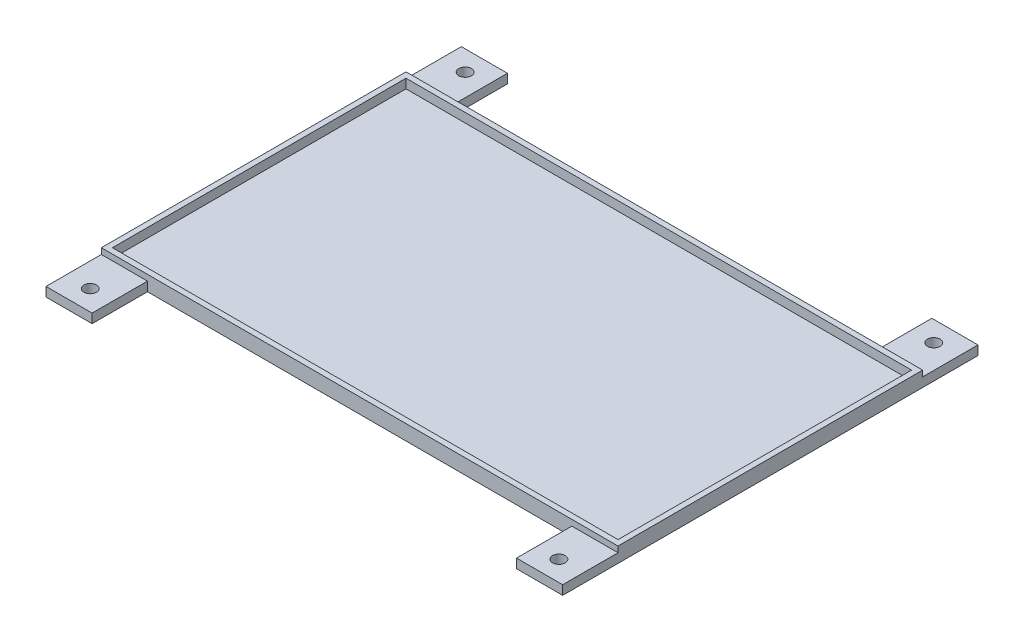
ISO-10303-21;
HEADER;
FILE_DESCRIPTION(('STEP AP214'),'2;1');
FILE_NAME('part.step','',(''),(''),'','','');
FILE_SCHEMA(('AUTOMOTIVE_DESIGN { 1 0 10303 214 1 1 1 1 }'));
ENDSEC;
DATA;
#1=APPLICATION_CONTEXT('core data for automotive mechanical design processes');
#2=APPLICATION_PROTOCOL_DEFINITION('international standard','automotive_design',2000,#1);
#3=PRODUCT_CONTEXT('',#1,'mechanical');
#4=PRODUCT('Part','Part','',(#3));
#5=PRODUCT_RELATED_PRODUCT_CATEGORY('part','',(#4));
#6=PRODUCT_DEFINITION_FORMATION('','',#4);
#7=PRODUCT_DEFINITION_CONTEXT('part definition',#1,'design');
#8=PRODUCT_DEFINITION('design','',#6,#7);
#9=PRODUCT_DEFINITION_SHAPE('','',#8);
#10=(LENGTH_UNIT() NAMED_UNIT(*) SI_UNIT(.MILLI.,.METRE.));
#11=(NAMED_UNIT(*) PLANE_ANGLE_UNIT() SI_UNIT($,.RADIAN.));
#12=(NAMED_UNIT(*) SI_UNIT($,.STERADIAN.) SOLID_ANGLE_UNIT());
#13=UNCERTAINTY_MEASURE_WITH_UNIT(LENGTH_MEASURE(1.E-05),#10,'distance_accuracy_value','');
#14=(GEOMETRIC_REPRESENTATION_CONTEXT(3) GLOBAL_UNCERTAINTY_ASSIGNED_CONTEXT((#13)) GLOBAL_UNIT_ASSIGNED_CONTEXT((#10,
#11,#12)) REPRESENTATION_CONTEXT('',''));
#15=CARTESIAN_POINT('',(0.,0.,0.));
#16=DIRECTION('',(0.,0.,1.));
#17=DIRECTION('',(1.,0.,0.));
#18=AXIS2_PLACEMENT_3D('',#15,#16,#17);
#19=CARTESIAN_POINT('',(-140.,3.175,-82.55));
#20=DIRECTION('',(0.,0.,1.));
#21=DIRECTION('',(1.,0.,0.));
#22=AXIS2_PLACEMENT_3D('',#19,#20,#21);
#23=PLANE('',#22);
#24=DIRECTION('',(1.,0.,0.));
#25=VECTOR('',#24,1.);
#26=CARTESIAN_POINT('',(140.,5.,-82.55));
#27=LINE('',#26,#25);
#28=CARTESIAN_POINT('',(115.,5.,-82.55));
#29=VERTEX_POINT('',#28);
#30=CARTESIAN_POINT('',(140.,5.,-82.55));
#31=VERTEX_POINT('',#30);
#32=EDGE_CURVE('E254',#29,#31,#27,.T.);
#33=ORIENTED_EDGE('',*,*,#32,.F.);
#34=DIRECTION('',(0.,-1.,0.));
#35=VECTOR('',#34,1.);
#36=CARTESIAN_POINT('',(115.,5.,-82.55));
#37=LINE('',#36,#35);
#38=CARTESIAN_POINT('',(115.,0.,-82.55));
#39=VERTEX_POINT('',#38);
#40=EDGE_CURVE('E251',#29,#39,#37,.T.);
#41=ORIENTED_EDGE('',*,*,#40,.T.);
#42=DIRECTION('',(-1.,0.,0.));
#43=VECTOR('',#42,1.);
#44=CARTESIAN_POINT('',(-140.,0.,-82.55));
#45=LINE('',#44,#43);
#46=CARTESIAN_POINT('',(-115.,0.,-82.55));
#47=VERTEX_POINT('',#46);
#48=EDGE_CURVE('E67',#39,#47,#45,.T.);
#49=ORIENTED_EDGE('',*,*,#48,.T.);
#50=DIRECTION('',(0.,-1.,0.));
#51=VECTOR('',#50,1.);
#52=CARTESIAN_POINT('',(-115.,5.,-82.55));
#53=LINE('',#52,#51);
#54=CARTESIAN_POINT('',(-115.,5.,-82.55));
#55=VERTEX_POINT('',#54);
#56=EDGE_CURVE('E352',#55,#47,#53,.T.);
#57=ORIENTED_EDGE('',*,*,#56,.F.);
#58=DIRECTION('',(1.,0.,0.));
#59=VECTOR('',#58,1.);
#60=CARTESIAN_POINT('',(-140.,5.,-82.55));
#61=LINE('',#60,#59);
#62=CARTESIAN_POINT('',(-140.,5.,-82.55));
#63=VERTEX_POINT('',#62);
#64=EDGE_CURVE('E61',#63,#55,#61,.T.);
#65=ORIENTED_EDGE('',*,*,#64,.F.);
#66=DIRECTION('',(0.,-1.,0.));
#67=VECTOR('',#66,1.);
#68=CARTESIAN_POINT('',(-140.,3.175,-82.55));
#69=LINE('',#68,#67);
#70=CARTESIAN_POINT('',(-140.,8.175,-82.55));
#71=VERTEX_POINT('',#70);
#72=EDGE_CURVE('E54',#71,#63,#69,.T.);
#73=ORIENTED_EDGE('',*,*,#72,.F.);
#74=DIRECTION('',(-1.,0.,0.));
#75=VECTOR('',#74,1.);
#76=CARTESIAN_POINT('',(140.,8.175,-82.55));
#77=LINE('',#76,#75);
#78=CARTESIAN_POINT('',(140.,8.175,-82.55));
#79=VERTEX_POINT('',#78);
#80=EDGE_CURVE('E405',#79,#71,#77,.T.);
#81=ORIENTED_EDGE('',*,*,#80,.F.);
#82=DIRECTION('',(0.,-1.,0.));
#83=VECTOR('',#82,1.);
#84=CARTESIAN_POINT('',(140.,3.175,-82.55));
#85=LINE('',#84,#83);
#86=EDGE_CURVE('E11',#79,#31,#85,.T.);
#87=ORIENTED_EDGE('',*,*,#86,.T.);
#88=EDGE_LOOP('',(#33,#41,#49,#57,#65,#73,#81,#87));
#89=FACE_BOUND('',#88,.T.);
#90=ADVANCED_FACE('F45',(#89),#23,.F.);
#91=CARTESIAN_POINT('',(-140.,3.175,82.55));
#92=DIRECTION('',(0.,0.,-1.));
#93=DIRECTION('',(-1.,0.,0.));
#94=AXIS2_PLACEMENT_3D('',#91,#92,#93);
#95=PLANE('',#94);
#96=DIRECTION('',(-1.,0.,0.));
#97=VECTOR('',#96,1.);
#98=CARTESIAN_POINT('',(-140.,5.,82.55));
#99=LINE('',#98,#97);
#100=CARTESIAN_POINT('',(-115.,5.,82.55));
#101=VERTEX_POINT('',#100);
#102=CARTESIAN_POINT('',(-140.,5.,82.55));
#103=VERTEX_POINT('',#102);
#104=EDGE_CURVE('E292',#101,#103,#99,.T.);
#105=ORIENTED_EDGE('',*,*,#104,.F.);
#106=DIRECTION('',(0.,-1.,0.));
#107=VECTOR('',#106,1.);
#108=CARTESIAN_POINT('',(-115.,5.,82.55));
#109=LINE('',#108,#107);
#110=CARTESIAN_POINT('',(-115.,0.,82.55));
#111=VERTEX_POINT('',#110);
#112=EDGE_CURVE('E288',#101,#111,#109,.T.);
#113=ORIENTED_EDGE('',*,*,#112,.T.);
#114=DIRECTION('',(1.,0.,0.));
#115=VECTOR('',#114,1.);
#116=CARTESIAN_POINT('',(-140.,0.,82.55));
#117=LINE('',#116,#115);
#118=CARTESIAN_POINT('',(115.,0.,82.55));
#119=VERTEX_POINT('',#118);
#120=EDGE_CURVE('E417',#111,#119,#117,.T.);
#121=ORIENTED_EDGE('',*,*,#120,.T.);
#122=DIRECTION('',(0.,-1.,0.));
#123=VECTOR('',#122,1.);
#124=CARTESIAN_POINT('',(115.,5.,82.55));
#125=LINE('',#124,#123);
#126=CARTESIAN_POINT('',(115.,5.,82.55));
#127=VERTEX_POINT('',#126);
#128=EDGE_CURVE('E220',#127,#119,#125,.T.);
#129=ORIENTED_EDGE('',*,*,#128,.F.);
#130=DIRECTION('',(-1.,0.,0.));
#131=VECTOR('',#130,1.);
#132=CARTESIAN_POINT('',(140.,5.,82.55));
#133=LINE('',#132,#131);
#134=CARTESIAN_POINT('',(140.,5.,82.55));
#135=VERTEX_POINT('',#134);
#136=EDGE_CURVE('E229',#135,#127,#133,.T.);
#137=ORIENTED_EDGE('',*,*,#136,.F.);
#138=DIRECTION('',(0.,-1.,0.));
#139=VECTOR('',#138,1.);
#140=CARTESIAN_POINT('',(140.,3.175,82.55));
#141=LINE('',#140,#139);
#142=CARTESIAN_POINT('',(140.,8.175,82.55));
#143=VERTEX_POINT('',#142);
#144=EDGE_CURVE('E420',#143,#135,#141,.T.);
#145=ORIENTED_EDGE('',*,*,#144,.F.);
#146=DIRECTION('',(1.,0.,0.));
#147=VECTOR('',#146,1.);
#148=CARTESIAN_POINT('',(-140.,8.175,82.55));
#149=LINE('',#148,#147);
#150=CARTESIAN_POINT('',(-140.,8.175,82.55));
#151=VERTEX_POINT('',#150);
#152=EDGE_CURVE('E397',#151,#143,#149,.T.);
#153=ORIENTED_EDGE('',*,*,#152,.F.);
#154=DIRECTION('',(0.,-1.,0.));
#155=VECTOR('',#154,1.);
#156=CARTESIAN_POINT('',(-140.,3.175,82.55));
#157=LINE('',#156,#155);
#158=EDGE_CURVE('E423',#151,#103,#157,.T.);
#159=ORIENTED_EDGE('',*,*,#158,.T.);
#160=EDGE_LOOP('',(#105,#113,#121,#129,#137,#145,#153,#159));
#161=FACE_BOUND('',#160,.T.);
#162=ADVANCED_FACE('F457',(#161),#95,.F.);
#163=CARTESIAN_POINT('',(140.,3.175,82.55));
#164=DIRECTION('',(-1.,0.,0.));
#165=DIRECTION('',(0.,0.,1.));
#166=AXIS2_PLACEMENT_3D('',#163,#164,#165);
#167=PLANE('',#166);
#168=DIRECTION('',(0.,0.,-1.));
#169=VECTOR('',#168,1.);
#170=CARTESIAN_POINT('',(140.,0.,82.55));
#171=LINE('',#170,#169);
#172=CARTESIAN_POINT('',(140.,0.,112.55));
#173=VERTEX_POINT('',#172);
#174=CARTESIAN_POINT('',(140.,0.,-112.55));
#175=VERTEX_POINT('',#174);
#176=EDGE_CURVE('E183',#173,#175,#171,.T.);
#177=ORIENTED_EDGE('',*,*,#176,.T.);
#178=DIRECTION('',(0.,-1.,0.));
#179=VECTOR('',#178,1.);
#180=CARTESIAN_POINT('',(140.,5.,-112.55));
#181=LINE('',#180,#179);
#182=CARTESIAN_POINT('',(140.,5.,-112.55));
#183=VERTEX_POINT('',#182);
#184=EDGE_CURVE('E243',#183,#175,#181,.T.);
#185=ORIENTED_EDGE('',*,*,#184,.F.);
#186=DIRECTION('',(0.,0.,-1.));
#187=VECTOR('',#186,1.);
#188=CARTESIAN_POINT('',(140.,5.,-82.55));
#189=LINE('',#188,#187);
#190=EDGE_CURVE('E258',#31,#183,#189,.T.);
#191=ORIENTED_EDGE('',*,*,#190,.F.);
#192=ORIENTED_EDGE('',*,*,#86,.F.);
#193=DIRECTION('',(0.,0.,-1.));
#194=VECTOR('',#193,1.);
#195=CARTESIAN_POINT('',(140.,8.175,82.55));
#196=LINE('',#195,#194);
#197=EDGE_CURVE('E401',#143,#79,#196,.T.);
#198=ORIENTED_EDGE('',*,*,#197,.F.);
#199=ORIENTED_EDGE('',*,*,#144,.T.);
#200=DIRECTION('',(0.,0.,-1.));
#201=VECTOR('',#200,1.);
#202=CARTESIAN_POINT('',(140.,5.,82.55));
#203=LINE('',#202,#201);
#204=CARTESIAN_POINT('',(140.,5.,112.55));
#205=VERTEX_POINT('',#204);
#206=EDGE_CURVE('E209',#205,#135,#203,.T.);
#207=ORIENTED_EDGE('',*,*,#206,.F.);
#208=DIRECTION('',(0.,-1.,0.));
#209=VECTOR('',#208,1.);
#210=CARTESIAN_POINT('',(140.,5.,112.55));
#211=LINE('',#210,#209);
#212=EDGE_CURVE('E203',#205,#173,#211,.T.);
#213=ORIENTED_EDGE('',*,*,#212,.T.);
#214=EDGE_LOOP('',(#177,#185,#191,#192,#198,#199,#207,#213));
#215=FACE_BOUND('',#214,.T.);
#216=ADVANCED_FACE('F47',(#215),#167,.F.);
#217=CARTESIAN_POINT('',(-140.,3.175,82.55));
#218=DIRECTION('',(1.,0.,0.));
#219=DIRECTION('',(0.,0.,-1.));
#220=AXIS2_PLACEMENT_3D('',#217,#218,#219);
#221=PLANE('',#220);
#222=DIRECTION('',(0.,0.,1.));
#223=VECTOR('',#222,1.);
#224=CARTESIAN_POINT('',(-140.,0.,82.55));
#225=LINE('',#224,#223);
#226=CARTESIAN_POINT('',(-140.,0.,-112.55));
#227=VERTEX_POINT('',#226);
#228=CARTESIAN_POINT('',(-140.,0.,112.55));
#229=VERTEX_POINT('',#228);
#230=EDGE_CURVE('E414',#227,#229,#225,.T.);
#231=ORIENTED_EDGE('',*,*,#230,.T.);
#232=DIRECTION('',(0.,-1.,0.));
#233=VECTOR('',#232,1.);
#234=CARTESIAN_POINT('',(-140.,5.,112.55));
#235=LINE('',#234,#233);
#236=CARTESIAN_POINT('',(-140.,5.,112.55));
#237=VERTEX_POINT('',#236);
#238=EDGE_CURVE('E239',#237,#229,#235,.T.);
#239=ORIENTED_EDGE('',*,*,#238,.F.);
#240=DIRECTION('',(0.,0.,1.));
#241=VECTOR('',#240,1.);
#242=CARTESIAN_POINT('',(-140.,5.,82.55));
#243=LINE('',#242,#241);
#244=EDGE_CURVE('E297',#103,#237,#243,.T.);
#245=ORIENTED_EDGE('',*,*,#244,.F.);
#246=ORIENTED_EDGE('',*,*,#158,.F.);
#247=DIRECTION('',(0.,0.,1.));
#248=VECTOR('',#247,1.);
#249=CARTESIAN_POINT('',(-140.,8.175,-82.55));
#250=LINE('',#249,#248);
#251=EDGE_CURVE('E196',#71,#151,#250,.T.);
#252=ORIENTED_EDGE('',*,*,#251,.F.);
#253=ORIENTED_EDGE('',*,*,#72,.T.);
#254=DIRECTION('',(0.,0.,1.));
#255=VECTOR('',#254,1.);
#256=CARTESIAN_POINT('',(-140.,5.,-82.55));
#257=LINE('',#256,#255);
#258=CARTESIAN_POINT('',(-140.,5.,-112.55));
#259=VERTEX_POINT('',#258);
#260=EDGE_CURVE('E326',#259,#63,#257,.T.);
#261=ORIENTED_EDGE('',*,*,#260,.F.);
#262=DIRECTION('',(0.,-1.,0.));
#263=VECTOR('',#262,1.);
#264=CARTESIAN_POINT('',(-140.,5.,-112.55));
#265=LINE('',#264,#263);
#266=EDGE_CURVE('E339',#259,#227,#265,.T.);
#267=ORIENTED_EDGE('',*,*,#266,.T.);
#268=EDGE_LOOP('',(#231,#239,#245,#246,#252,#253,#261,#267));
#269=FACE_BOUND('',#268,.T.);
#270=ADVANCED_FACE('F430',(#269),#221,.F.);
#271=CARTESIAN_POINT('',(0.,0.,0.));
#272=DIRECTION('',(0.,-1.,0.));
#273=DIRECTION('',(0.,0.,-1.));
#274=AXIS2_PLACEMENT_3D('',#271,#272,#273);
#275=PLANE('',#274);
#276=ORIENTED_EDGE('',*,*,#176,.F.);
#277=DIRECTION('',(1.,0.,0.));
#278=VECTOR('',#277,1.);
#279=CARTESIAN_POINT('',(140.,0.,112.55));
#280=LINE('',#279,#278);
#281=CARTESIAN_POINT('',(115.,0.,112.55));
#282=VERTEX_POINT('',#281);
#283=EDGE_CURVE('E188',#282,#173,#280,.T.);
#284=ORIENTED_EDGE('',*,*,#283,.F.);
#285=DIRECTION('',(0.,0.,1.));
#286=VECTOR('',#285,1.);
#287=CARTESIAN_POINT('',(115.,0.,82.55));
#288=LINE('',#287,#286);
#289=EDGE_CURVE('E208',#119,#282,#288,.T.);
#290=ORIENTED_EDGE('',*,*,#289,.F.);
#291=ORIENTED_EDGE('',*,*,#120,.F.);
#292=DIRECTION('',(0.,0.,-1.));
#293=VECTOR('',#292,1.);
#294=CARTESIAN_POINT('',(-115.,0.,82.55));
#295=LINE('',#294,#293);
#296=CARTESIAN_POINT('',(-115.,0.,112.55));
#297=VERTEX_POINT('',#296);
#298=EDGE_CURVE('E293',#297,#111,#295,.T.);
#299=ORIENTED_EDGE('',*,*,#298,.F.);
#300=DIRECTION('',(1.,0.,0.));
#301=VECTOR('',#300,1.);
#302=CARTESIAN_POINT('',(-140.,0.,112.55));
#303=LINE('',#302,#301);
#304=EDGE_CURVE('E296',#229,#297,#303,.T.);
#305=ORIENTED_EDGE('',*,*,#304,.F.);
#306=ORIENTED_EDGE('',*,*,#230,.F.);
#307=DIRECTION('',(-1.,0.,0.));
#308=VECTOR('',#307,1.);
#309=CARTESIAN_POINT('',(-140.,0.,-112.55));
#310=LINE('',#309,#308);
#311=CARTESIAN_POINT('',(-115.,0.,-112.55));
#312=VERTEX_POINT('',#311);
#313=EDGE_CURVE('E330',#312,#227,#310,.T.);
#314=ORIENTED_EDGE('',*,*,#313,.F.);
#315=DIRECTION('',(0.,0.,-1.));
#316=VECTOR('',#315,1.);
#317=CARTESIAN_POINT('',(-115.,0.,-82.55));
#318=LINE('',#317,#316);
#319=EDGE_CURVE('E322',#47,#312,#318,.T.);
#320=ORIENTED_EDGE('',*,*,#319,.F.);
#321=ORIENTED_EDGE('',*,*,#48,.F.);
#322=DIRECTION('',(0.,0.,1.));
#323=VECTOR('',#322,1.);
#324=CARTESIAN_POINT('',(115.,0.,-82.55));
#325=LINE('',#324,#323);
#326=CARTESIAN_POINT('',(115.,0.,-112.55));
#327=VERTEX_POINT('',#326);
#328=EDGE_CURVE('E255',#327,#39,#325,.T.);
#329=ORIENTED_EDGE('',*,*,#328,.F.);
#330=DIRECTION('',(-1.,0.,0.));
#331=VECTOR('',#330,1.);
#332=CARTESIAN_POINT('',(140.,0.,-112.55));
#333=LINE('',#332,#331);
#334=EDGE_CURVE('E190',#175,#327,#333,.T.);
#335=ORIENTED_EDGE('',*,*,#334,.F.);
#336=EDGE_LOOP('',(#276,#284,#290,#291,#299,#305,#306,#314,#320,#321,#329,#335));
#337=FACE_BOUND('',#336,.T.);
#338=CARTESIAN_POINT('',(127.,0.,101.6));
#339=DIRECTION('',(0.,1.,0.));
#340=DIRECTION('',(0.,0.,1.));
#341=AXIS2_PLACEMENT_3D('',#338,#339,#340);
#342=CIRCLE('',#341,3.429);
#343=CARTESIAN_POINT('',(127.,0.,105.029));
#344=VERTEX_POINT('',#343);
#345=EDGE_CURVE('E235',#344,#344,#342,.T.);
#346=ORIENTED_EDGE('',*,*,#345,.T.);
#347=EDGE_LOOP('',(#346));
#348=FACE_BOUND('',#347,.T.);
#349=CARTESIAN_POINT('',(-127.,0.,101.6));
#350=DIRECTION('',(0.,1.,0.));
#351=DIRECTION('',(0.,0.,1.));
#352=AXIS2_PLACEMENT_3D('',#349,#350,#351);
#353=CIRCLE('',#352,3.429);
#354=CARTESIAN_POINT('',(-127.,0.,105.029));
#355=VERTEX_POINT('',#354);
#356=EDGE_CURVE('E247',#355,#355,#353,.T.);
#357=ORIENTED_EDGE('',*,*,#356,.T.);
#358=EDGE_LOOP('',(#357));
#359=FACE_BOUND('',#358,.T.);
#360=CARTESIAN_POINT('',(-127.,0.,-101.6));
#361=DIRECTION('',(0.,1.,0.));
#362=DIRECTION('',(0.,0.,1.));
#363=AXIS2_PLACEMENT_3D('',#360,#361,#362);
#364=CIRCLE('',#363,3.429);
#365=CARTESIAN_POINT('',(-127.,0.,-98.171));
#366=VERTEX_POINT('',#365);
#367=EDGE_CURVE('E277',#366,#366,#364,.T.);
#368=ORIENTED_EDGE('',*,*,#367,.T.);
#369=EDGE_LOOP('',(#368));
#370=FACE_BOUND('',#369,.T.);
#371=CARTESIAN_POINT('',(127.,0.,-101.6));
#372=DIRECTION('',(0.,1.,0.));
#373=DIRECTION('',(0.,0.,1.));
#374=AXIS2_PLACEMENT_3D('',#371,#372,#373);
#375=CIRCLE('',#374,3.429);
#376=CARTESIAN_POINT('',(127.,0.,-98.1709999999999));
#377=VERTEX_POINT('',#376);
#378=EDGE_CURVE('E273',#377,#377,#375,.T.);
#379=ORIENTED_EDGE('',*,*,#378,.T.);
#380=EDGE_LOOP('',(#379));
#381=FACE_BOUND('',#380,.T.);
#382=ADVANCED_FACE('F185',(#337,#348,#359,#370,#381),#275,.T.);
#383=CARTESIAN_POINT('',(0.,8.175,0.));
#384=DIRECTION('',(0.,1.,0.));
#385=DIRECTION('',(0.,0.,1.));
#386=AXIS2_PLACEMENT_3D('',#383,#384,#385);
#387=PLANE('',#386);
#388=ORIENTED_EDGE('',*,*,#152,.T.);
#389=ORIENTED_EDGE('',*,*,#197,.T.);
#390=ORIENTED_EDGE('',*,*,#80,.T.);
#391=ORIENTED_EDGE('',*,*,#251,.T.);
#392=EDGE_LOOP('',(#388,#389,#390,#391));
#393=FACE_BOUND('',#392,.T.);
#394=DIRECTION('',(0.,0.,-1.));
#395=VECTOR('',#394,1.);
#396=CARTESIAN_POINT('',(137.,8.175,79.55));
#397=LINE('',#396,#395);
#398=CARTESIAN_POINT('',(137.,8.175,79.55));
#399=VERTEX_POINT('',#398);
#400=CARTESIAN_POINT('',(137.,8.175,-79.55));
#401=VERTEX_POINT('',#400);
#402=EDGE_CURVE('E359',#399,#401,#397,.T.);
#403=ORIENTED_EDGE('',*,*,#402,.F.);
#404=DIRECTION('',(1.,0.,0.));
#405=VECTOR('',#404,1.);
#406=CARTESIAN_POINT('',(-137.,8.175,79.55));
#407=LINE('',#406,#405);
#408=CARTESIAN_POINT('',(-137.,8.175,79.55));
#409=VERTEX_POINT('',#408);
#410=EDGE_CURVE('E356',#409,#399,#407,.T.);
#411=ORIENTED_EDGE('',*,*,#410,.F.);
#412=DIRECTION('',(0.,0.,1.));
#413=VECTOR('',#412,1.);
#414=CARTESIAN_POINT('',(-137.,8.175,-79.5499999999999));
#415=LINE('',#414,#413);
#416=CARTESIAN_POINT('',(-137.,8.175,-79.5499999999999));
#417=VERTEX_POINT('',#416);
#418=EDGE_CURVE('E367',#417,#409,#415,.T.);
#419=ORIENTED_EDGE('',*,*,#418,.F.);
#420=DIRECTION('',(-1.,0.,0.));
#421=VECTOR('',#420,1.);
#422=CARTESIAN_POINT('',(137.,8.175,-79.55));
#423=LINE('',#422,#421);
#424=EDGE_CURVE('E363',#401,#417,#423,.T.);
#425=ORIENTED_EDGE('',*,*,#424,.F.);
#426=EDGE_LOOP('',(#403,#411,#419,#425));
#427=FACE_BOUND('',#426,.T.);
#428=ADVANCED_FACE('F460',(#393,#427),#387,.T.);
#429=CARTESIAN_POINT('',(-137.,8.175,79.55));
#430=DIRECTION('',(0.,0.,-1.));
#431=DIRECTION('',(-1.,0.,0.));
#432=AXIS2_PLACEMENT_3D('',#429,#430,#431);
#433=PLANE('',#432);
#434=DIRECTION('',(1.,0.,0.));
#435=VECTOR('',#434,1.);
#436=CARTESIAN_POINT('',(-137.,3.175,79.55));
#437=LINE('',#436,#435);
#438=CARTESIAN_POINT('',(-137.,3.175,79.55));
#439=VERTEX_POINT('',#438);
#440=CARTESIAN_POINT('',(137.,3.175,79.55));
#441=VERTEX_POINT('',#440);
#442=EDGE_CURVE('E355',#439,#441,#437,.T.);
#443=ORIENTED_EDGE('',*,*,#442,.F.);
#444=DIRECTION('',(0.,-1.,0.));
#445=VECTOR('',#444,1.);
#446=CARTESIAN_POINT('',(-137.,8.175,79.55));
#447=LINE('',#446,#445);
#448=EDGE_CURVE('E370',#409,#439,#447,.T.);
#449=ORIENTED_EDGE('',*,*,#448,.F.);
#450=ORIENTED_EDGE('',*,*,#410,.T.);
#451=DIRECTION('',(0.,-1.,0.));
#452=VECTOR('',#451,1.);
#453=CARTESIAN_POINT('',(137.,8.175,79.55));
#454=LINE('',#453,#452);
#455=EDGE_CURVE('E393',#399,#441,#454,.T.);
#456=ORIENTED_EDGE('',*,*,#455,.T.);
#457=EDGE_LOOP('',(#443,#449,#450,#456));
#458=FACE_BOUND('',#457,.T.);
#459=ADVANCED_FACE('F504',(#458),#433,.T.);
#460=CARTESIAN_POINT('',(137.,8.175,79.55));
#461=DIRECTION('',(-1.,0.,0.));
#462=DIRECTION('',(0.,0.,1.));
#463=AXIS2_PLACEMENT_3D('',#460,#461,#462);
#464=PLANE('',#463);
#465=DIRECTION('',(0.,0.,-1.));
#466=VECTOR('',#465,1.);
#467=CARTESIAN_POINT('',(137.,3.175,79.55));
#468=LINE('',#467,#466);
#469=CARTESIAN_POINT('',(137.,3.175,-79.55));
#470=VERTEX_POINT('',#469);
#471=EDGE_CURVE('E374',#441,#470,#468,.T.);
#472=ORIENTED_EDGE('',*,*,#471,.F.);
#473=ORIENTED_EDGE('',*,*,#455,.F.);
#474=ORIENTED_EDGE('',*,*,#402,.T.);
#475=DIRECTION('',(0.,-1.,0.));
#476=VECTOR('',#475,1.);
#477=CARTESIAN_POINT('',(137.,8.175,-79.55));
#478=LINE('',#477,#476);
#479=EDGE_CURVE('E390',#401,#470,#478,.T.);
#480=ORIENTED_EDGE('',*,*,#479,.T.);
#481=EDGE_LOOP('',(#472,#473,#474,#480));
#482=FACE_BOUND('',#481,.T.);
#483=ADVANCED_FACE('F507',(#482),#464,.T.);
#484=CARTESIAN_POINT('',(137.,8.175,-79.55));
#485=DIRECTION('',(0.,0.,1.));
#486=DIRECTION('',(1.,0.,0.));
#487=AXIS2_PLACEMENT_3D('',#484,#485,#486);
#488=PLANE('',#487);
#489=DIRECTION('',(-1.,0.,0.));
#490=VECTOR('',#489,1.);
#491=CARTESIAN_POINT('',(137.,3.175,-79.55));
#492=LINE('',#491,#490);
#493=CARTESIAN_POINT('',(-137.,3.175,-79.5499999999999));
#494=VERTEX_POINT('',#493);
#495=EDGE_CURVE('E378',#470,#494,#492,.T.);
#496=ORIENTED_EDGE('',*,*,#495,.F.);
#497=ORIENTED_EDGE('',*,*,#479,.F.);
#498=ORIENTED_EDGE('',*,*,#424,.T.);
#499=DIRECTION('',(0.,-1.,0.));
#500=VECTOR('',#499,1.);
#501=CARTESIAN_POINT('',(-137.,8.175,-79.5499999999999));
#502=LINE('',#501,#500);
#503=EDGE_CURVE('E387',#417,#494,#502,.T.);
#504=ORIENTED_EDGE('',*,*,#503,.T.);
#505=EDGE_LOOP('',(#496,#497,#498,#504));
#506=FACE_BOUND('',#505,.T.);
#507=ADVANCED_FACE('F511',(#506),#488,.T.);
#508=CARTESIAN_POINT('',(-137.,8.175,-79.5499999999999));
#509=DIRECTION('',(1.,0.,0.));
#510=DIRECTION('',(0.,0.,-1.));
#511=AXIS2_PLACEMENT_3D('',#508,#509,#510);
#512=PLANE('',#511);
#513=DIRECTION('',(0.,0.,1.));
#514=VECTOR('',#513,1.);
#515=CARTESIAN_POINT('',(-137.,3.175,-79.5499999999999));
#516=LINE('',#515,#514);
#517=EDGE_CURVE('E360',#494,#439,#516,.T.);
#518=ORIENTED_EDGE('',*,*,#517,.F.);
#519=ORIENTED_EDGE('',*,*,#503,.F.);
#520=ORIENTED_EDGE('',*,*,#418,.T.);
#521=ORIENTED_EDGE('',*,*,#448,.T.);
#522=EDGE_LOOP('',(#518,#519,#520,#521));
#523=FACE_BOUND('',#522,.T.);
#524=ADVANCED_FACE('F500',(#523),#512,.T.);
#525=CARTESIAN_POINT('',(0.,3.175,0.));
#526=DIRECTION('',(0.,-1.,0.));
#527=DIRECTION('',(0.,0.,-1.));
#528=AXIS2_PLACEMENT_3D('',#525,#526,#527);
#529=PLANE('',#528);
#530=ORIENTED_EDGE('',*,*,#517,.T.);
#531=ORIENTED_EDGE('',*,*,#442,.T.);
#532=ORIENTED_EDGE('',*,*,#471,.T.);
#533=ORIENTED_EDGE('',*,*,#495,.T.);
#534=EDGE_LOOP('',(#530,#531,#532,#533));
#535=FACE_BOUND('',#534,.T.);
#536=ADVANCED_FACE('F497',(#535),#529,.F.);
#537=CARTESIAN_POINT('',(0.,5.,0.));
#538=DIRECTION('',(0.,-1.,0.));
#539=DIRECTION('',(0.,0.,-1.));
#540=AXIS2_PLACEMENT_3D('',#537,#538,#539);
#541=PLANE('',#540);
#542=ORIENTED_EDGE('',*,*,#206,.T.);
#543=ORIENTED_EDGE('',*,*,#136,.T.);
#544=DIRECTION('',(0.,0.,1.));
#545=VECTOR('',#544,1.);
#546=CARTESIAN_POINT('',(115.,5.,82.55));
#547=LINE('',#546,#545);
#548=CARTESIAN_POINT('',(115.,5.,112.55));
#549=VERTEX_POINT('',#548);
#550=EDGE_CURVE('E218',#127,#549,#547,.T.);
#551=ORIENTED_EDGE('',*,*,#550,.T.);
#552=DIRECTION('',(1.,0.,0.));
#553=VECTOR('',#552,1.);
#554=CARTESIAN_POINT('',(140.,5.,112.55));
#555=LINE('',#554,#553);
#556=EDGE_CURVE('E214',#549,#205,#555,.T.);
#557=ORIENTED_EDGE('',*,*,#556,.T.);
#558=EDGE_LOOP('',(#542,#543,#551,#557));
#559=FACE_BOUND('',#558,.T.);
#560=CARTESIAN_POINT('',(127.,5.,101.6));
#561=DIRECTION('',(0.,1.,0.));
#562=DIRECTION('',(0.,0.,1.));
#563=AXIS2_PLACEMENT_3D('',#560,#561,#562);
#564=CIRCLE('',#563,3.429);
#565=CARTESIAN_POINT('',(127.,5.,105.029));
#566=VERTEX_POINT('',#565);
#567=EDGE_CURVE('E225',#566,#566,#564,.T.);
#568=ORIENTED_EDGE('',*,*,#567,.F.);
#569=EDGE_LOOP('',(#568));
#570=FACE_BOUND('',#569,.T.);
#571=ADVANCED_FACE('F499',(#559,#570),#541,.F.);
#572=CARTESIAN_POINT('',(115.,5.,82.55));
#573=DIRECTION('',(1.,0.,0.));
#574=DIRECTION('',(0.,0.,-1.));
#575=AXIS2_PLACEMENT_3D('',#572,#573,#574);
#576=PLANE('',#575);
#577=ORIENTED_EDGE('',*,*,#289,.T.);
#578=DIRECTION('',(0.,-1.,0.));
#579=VECTOR('',#578,1.);
#580=CARTESIAN_POINT('',(115.,5.,112.55));
#581=LINE('',#580,#579);
#582=EDGE_CURVE('E206',#549,#282,#581,.T.);
#583=ORIENTED_EDGE('',*,*,#582,.F.);
#584=ORIENTED_EDGE('',*,*,#550,.F.);
#585=ORIENTED_EDGE('',*,*,#128,.T.);
#586=EDGE_LOOP('',(#577,#583,#584,#585));
#587=FACE_BOUND('',#586,.T.);
#588=ADVANCED_FACE('F611',(#587),#576,.F.);
#589=CARTESIAN_POINT('',(140.,5.,112.55));
#590=DIRECTION('',(0.,0.,-1.));
#591=DIRECTION('',(-1.,0.,0.));
#592=AXIS2_PLACEMENT_3D('',#589,#590,#591);
#593=PLANE('',#592);
#594=ORIENTED_EDGE('',*,*,#283,.T.);
#595=ORIENTED_EDGE('',*,*,#212,.F.);
#596=ORIENTED_EDGE('',*,*,#556,.F.);
#597=ORIENTED_EDGE('',*,*,#582,.T.);
#598=EDGE_LOOP('',(#594,#595,#596,#597));
#599=FACE_BOUND('',#598,.T.);
#600=ADVANCED_FACE('F201',(#599),#593,.F.);
#601=CARTESIAN_POINT('',(127.,5.,101.6));
#602=DIRECTION('',(0.,-1.,0.));
#603=DIRECTION('',(0.,0.,-1.));
#604=AXIS2_PLACEMENT_3D('',#601,#602,#603);
#605=CYLINDRICAL_SURFACE('',#604,3.429);
#606=ORIENTED_EDGE('',*,*,#567,.T.);
#607=EDGE_LOOP('',(#606));
#608=FACE_BOUND('',#607,.T.);
#609=ORIENTED_EDGE('',*,*,#345,.F.);
#610=EDGE_LOOP('',(#609));
#611=FACE_BOUND('',#610,.T.);
#612=ADVANCED_FACE('F629',(#608,#611),#605,.F.);
#613=CARTESIAN_POINT('',(0.,5.,0.));
#614=DIRECTION('',(0.,1.,0.));
#615=DIRECTION('',(0.,0.,1.));
#616=AXIS2_PLACEMENT_3D('',#613,#614,#615);
#617=PLANE('',#616);
#618=ORIENTED_EDGE('',*,*,#244,.T.);
#619=DIRECTION('',(1.,0.,0.));
#620=VECTOR('',#619,1.);
#621=CARTESIAN_POINT('',(-140.,5.,112.55));
#622=LINE('',#621,#620);
#623=CARTESIAN_POINT('',(-115.,5.,112.55));
#624=VERTEX_POINT('',#623);
#625=EDGE_CURVE('E306',#237,#624,#622,.T.);
#626=ORIENTED_EDGE('',*,*,#625,.T.);
#627=DIRECTION('',(0.,0.,-1.));
#628=VECTOR('',#627,1.);
#629=CARTESIAN_POINT('',(-115.,5.,82.55));
#630=LINE('',#629,#628);
#631=EDGE_CURVE('E303',#624,#101,#630,.T.);
#632=ORIENTED_EDGE('',*,*,#631,.T.);
#633=ORIENTED_EDGE('',*,*,#104,.T.);
#634=EDGE_LOOP('',(#618,#626,#632,#633));
#635=FACE_BOUND('',#634,.T.);
#636=CARTESIAN_POINT('',(-127.,5.,101.6));
#637=DIRECTION('',(0.,1.,0.));
#638=DIRECTION('',(0.,0.,1.));
#639=AXIS2_PLACEMENT_3D('',#636,#637,#638);
#640=CIRCLE('',#639,3.429);
#641=CARTESIAN_POINT('',(-127.,5.,105.029));
#642=VERTEX_POINT('',#641);
#643=EDGE_CURVE('E300',#642,#642,#640,.T.);
#644=ORIENTED_EDGE('',*,*,#643,.F.);
#645=EDGE_LOOP('',(#644));
#646=FACE_BOUND('',#645,.T.);
#647=ADVANCED_FACE('F452',(#635,#646),#617,.T.);
#648=CARTESIAN_POINT('',(-140.,5.,112.55));
#649=DIRECTION('',(0.,0.,-1.));
#650=DIRECTION('',(-1.,0.,0.));
#651=AXIS2_PLACEMENT_3D('',#648,#649,#650);
#652=PLANE('',#651);
#653=ORIENTED_EDGE('',*,*,#304,.T.);
#654=DIRECTION('',(0.,-1.,0.));
#655=VECTOR('',#654,1.);
#656=CARTESIAN_POINT('',(-115.,5.,112.55));
#657=LINE('',#656,#655);
#658=EDGE_CURVE('E284',#624,#297,#657,.T.);
#659=ORIENTED_EDGE('',*,*,#658,.F.);
#660=ORIENTED_EDGE('',*,*,#625,.F.);
#661=ORIENTED_EDGE('',*,*,#238,.T.);
#662=EDGE_LOOP('',(#653,#659,#660,#661));
#663=FACE_BOUND('',#662,.T.);
#664=ADVANCED_FACE('F449',(#663),#652,.F.);
#665=CARTESIAN_POINT('',(-115.,5.,82.55));
#666=DIRECTION('',(-1.,0.,0.));
#667=DIRECTION('',(0.,0.,1.));
#668=AXIS2_PLACEMENT_3D('',#665,#666,#667);
#669=PLANE('',#668);
#670=ORIENTED_EDGE('',*,*,#298,.T.);
#671=ORIENTED_EDGE('',*,*,#112,.F.);
#672=ORIENTED_EDGE('',*,*,#631,.F.);
#673=ORIENTED_EDGE('',*,*,#658,.T.);
#674=EDGE_LOOP('',(#670,#671,#672,#673));
#675=FACE_BOUND('',#674,.T.);
#676=ADVANCED_FACE('F652',(#675),#669,.F.);
#677=CARTESIAN_POINT('',(-127.,5.,101.6));
#678=DIRECTION('',(0.,-1.,0.));
#679=DIRECTION('',(0.,0.,-1.));
#680=AXIS2_PLACEMENT_3D('',#677,#678,#679);
#681=CYLINDRICAL_SURFACE('',#680,3.429);
#682=ORIENTED_EDGE('',*,*,#643,.T.);
#683=EDGE_LOOP('',(#682));
#684=FACE_BOUND('',#683,.T.);
#685=ORIENTED_EDGE('',*,*,#356,.F.);
#686=EDGE_LOOP('',(#685));
#687=FACE_BOUND('',#686,.T.);
#688=ADVANCED_FACE('F483',(#684,#687),#681,.F.);
#689=CARTESIAN_POINT('',(0.,5.,0.));
#690=DIRECTION('',(0.,-1.,0.));
#691=DIRECTION('',(0.,0.,-1.));
#692=AXIS2_PLACEMENT_3D('',#689,#690,#691);
#693=PLANE('',#692);
#694=ORIENTED_EDGE('',*,*,#260,.T.);
#695=ORIENTED_EDGE('',*,*,#64,.T.);
#696=DIRECTION('',(0.,0.,-1.));
#697=VECTOR('',#696,1.);
#698=CARTESIAN_POINT('',(-115.,5.,-82.55));
#699=LINE('',#698,#697);
#700=CARTESIAN_POINT('',(-115.,5.,-112.55));
#701=VERTEX_POINT('',#700);
#702=EDGE_CURVE('E333',#55,#701,#699,.T.);
#703=ORIENTED_EDGE('',*,*,#702,.T.);
#704=DIRECTION('',(-1.,0.,0.));
#705=VECTOR('',#704,1.);
#706=CARTESIAN_POINT('',(-140.,5.,-112.55));
#707=LINE('',#706,#705);
#708=EDGE_CURVE('E336',#701,#259,#707,.T.);
#709=ORIENTED_EDGE('',*,*,#708,.T.);
#710=EDGE_LOOP('',(#694,#695,#703,#709));
#711=FACE_BOUND('',#710,.T.);
#712=CARTESIAN_POINT('',(-127.,5.,-101.6));
#713=DIRECTION('',(0.,1.,0.));
#714=DIRECTION('',(0.,0.,1.));
#715=AXIS2_PLACEMENT_3D('',#712,#713,#714);
#716=CIRCLE('',#715,3.429);
#717=CARTESIAN_POINT('',(-127.,5.,-98.171));
#718=VERTEX_POINT('',#717);
#719=EDGE_CURVE('E318',#718,#718,#716,.T.);
#720=ORIENTED_EDGE('',*,*,#719,.F.);
#721=EDGE_LOOP('',(#720));
#722=FACE_BOUND('',#721,.T.);
#723=ADVANCED_FACE('F433',(#711,#722),#693,.F.);
#724=CARTESIAN_POINT('',(-115.,5.,-82.55));
#725=DIRECTION('',(-1.,0.,0.));
#726=DIRECTION('',(0.,0.,1.));
#727=AXIS2_PLACEMENT_3D('',#724,#725,#726);
#728=PLANE('',#727);
#729=ORIENTED_EDGE('',*,*,#319,.T.);
#730=DIRECTION('',(0.,-1.,0.));
#731=VECTOR('',#730,1.);
#732=CARTESIAN_POINT('',(-115.,5.,-112.55));
#733=LINE('',#732,#731);
#734=EDGE_CURVE('E348',#701,#312,#733,.T.);
#735=ORIENTED_EDGE('',*,*,#734,.F.);
#736=ORIENTED_EDGE('',*,*,#702,.F.);
#737=ORIENTED_EDGE('',*,*,#56,.T.);
#738=EDGE_LOOP('',(#729,#735,#736,#737));
#739=FACE_BOUND('',#738,.T.);
#740=ADVANCED_FACE('F474',(#739),#728,.F.);
#741=CARTESIAN_POINT('',(-140.,5.,-112.55));
#742=DIRECTION('',(0.,0.,1.));
#743=DIRECTION('',(1.,0.,0.));
#744=AXIS2_PLACEMENT_3D('',#741,#742,#743);
#745=PLANE('',#744);
#746=ORIENTED_EDGE('',*,*,#313,.T.);
#747=ORIENTED_EDGE('',*,*,#266,.F.);
#748=ORIENTED_EDGE('',*,*,#708,.F.);
#749=ORIENTED_EDGE('',*,*,#734,.T.);
#750=EDGE_LOOP('',(#746,#747,#748,#749));
#751=FACE_BOUND('',#750,.T.);
#752=ADVANCED_FACE('F440',(#751),#745,.F.);
#753=CARTESIAN_POINT('',(-127.,5.,-101.6));
#754=DIRECTION('',(0.,-1.,0.));
#755=DIRECTION('',(0.,0.,-1.));
#756=AXIS2_PLACEMENT_3D('',#753,#754,#755);
#757=CYLINDRICAL_SURFACE('',#756,3.429);
#758=ORIENTED_EDGE('',*,*,#719,.T.);
#759=EDGE_LOOP('',(#758));
#760=FACE_BOUND('',#759,.T.);
#761=ORIENTED_EDGE('',*,*,#367,.F.);
#762=EDGE_LOOP('',(#761));
#763=FACE_BOUND('',#762,.T.);
#764=ADVANCED_FACE('F481',(#760,#763),#757,.F.);
#765=CARTESIAN_POINT('',(0.,5.,0.));
#766=DIRECTION('',(0.,1.,0.));
#767=DIRECTION('',(0.,0.,1.));
#768=AXIS2_PLACEMENT_3D('',#765,#766,#767);
#769=PLANE('',#768);
#770=ORIENTED_EDGE('',*,*,#190,.T.);
#771=DIRECTION('',(-1.,0.,0.));
#772=VECTOR('',#771,1.);
#773=CARTESIAN_POINT('',(140.,5.,-112.55));
#774=LINE('',#773,#772);
#775=CARTESIAN_POINT('',(115.,5.,-112.55));
#776=VERTEX_POINT('',#775);
#777=EDGE_CURVE('E267',#183,#776,#774,.T.);
#778=ORIENTED_EDGE('',*,*,#777,.T.);
#779=DIRECTION('',(0.,0.,1.));
#780=VECTOR('',#779,1.);
#781=CARTESIAN_POINT('',(115.,5.,-82.55));
#782=LINE('',#781,#780);
#783=EDGE_CURVE('E264',#776,#29,#782,.T.);
#784=ORIENTED_EDGE('',*,*,#783,.T.);
#785=ORIENTED_EDGE('',*,*,#32,.T.);
#786=EDGE_LOOP('',(#770,#778,#784,#785));
#787=FACE_BOUND('',#786,.T.);
#788=CARTESIAN_POINT('',(127.,5.,-101.6));
#789=DIRECTION('',(0.,1.,0.));
#790=DIRECTION('',(0.,0.,1.));
#791=AXIS2_PLACEMENT_3D('',#788,#789,#790);
#792=CIRCLE('',#791,3.429);
#793=CARTESIAN_POINT('',(127.,5.,-98.1709999999999));
#794=VERTEX_POINT('',#793);
#795=EDGE_CURVE('E261',#794,#794,#792,.T.);
#796=ORIENTED_EDGE('',*,*,#795,.F.);
#797=EDGE_LOOP('',(#796));
#798=FACE_BOUND('',#797,.T.);
#799=ADVANCED_FACE('F465',(#787,#798),#769,.T.);
#800=CARTESIAN_POINT('',(140.,5.,-112.55));
#801=DIRECTION('',(0.,0.,1.));
#802=DIRECTION('',(1.,0.,0.));
#803=AXIS2_PLACEMENT_3D('',#800,#801,#802);
#804=PLANE('',#803);
#805=ORIENTED_EDGE('',*,*,#334,.T.);
#806=DIRECTION('',(0.,-1.,0.));
#807=VECTOR('',#806,1.);
#808=CARTESIAN_POINT('',(115.,5.,-112.55));
#809=LINE('',#808,#807);
#810=EDGE_CURVE('E246',#776,#327,#809,.T.);
#811=ORIENTED_EDGE('',*,*,#810,.F.);
#812=ORIENTED_EDGE('',*,*,#777,.F.);
#813=ORIENTED_EDGE('',*,*,#184,.T.);
#814=EDGE_LOOP('',(#805,#811,#812,#813));
#815=FACE_BOUND('',#814,.T.);
#816=ADVANCED_FACE('F698',(#815),#804,.F.);
#817=CARTESIAN_POINT('',(115.,5.,-82.55));
#818=DIRECTION('',(1.,0.,0.));
#819=DIRECTION('',(0.,0.,-1.));
#820=AXIS2_PLACEMENT_3D('',#817,#818,#819);
#821=PLANE('',#820);
#822=ORIENTED_EDGE('',*,*,#328,.T.);
#823=ORIENTED_EDGE('',*,*,#40,.F.);
#824=ORIENTED_EDGE('',*,*,#783,.F.);
#825=ORIENTED_EDGE('',*,*,#810,.T.);
#826=EDGE_LOOP('',(#822,#823,#824,#825));
#827=FACE_BOUND('',#826,.T.);
#828=ADVANCED_FACE('F471',(#827),#821,.F.);
#829=CARTESIAN_POINT('',(127.,5.,-101.6));
#830=DIRECTION('',(0.,-1.,0.));
#831=DIRECTION('',(0.,0.,-1.));
#832=AXIS2_PLACEMENT_3D('',#829,#830,#831);
#833=CYLINDRICAL_SURFACE('',#832,3.429);
#834=ORIENTED_EDGE('',*,*,#795,.T.);
#835=EDGE_LOOP('',(#834));
#836=FACE_BOUND('',#835,.T.);
#837=ORIENTED_EDGE('',*,*,#378,.F.);
#838=EDGE_LOOP('',(#837));
#839=FACE_BOUND('',#838,.T.);
#840=ADVANCED_FACE('F714',(#836,#839),#833,.F.);
#841=CLOSED_SHELL('',(#90,#162,#216,#270,#382,#428,#459,#483,#507,#524,#536,#571,#588,#600,#612,
#647,#664,#676,#688,#723,#740,#752,#764,#799,#816,#828,#840));
#842=MANIFOLD_SOLID_BREP('B2',#841);
#843=ADVANCED_BREP_SHAPE_REPRESENTATION('',(#18,#842),#14);
#844=SHAPE_DEFINITION_REPRESENTATION(#9,#843);
ENDSEC;
END-ISO-10303-21;
